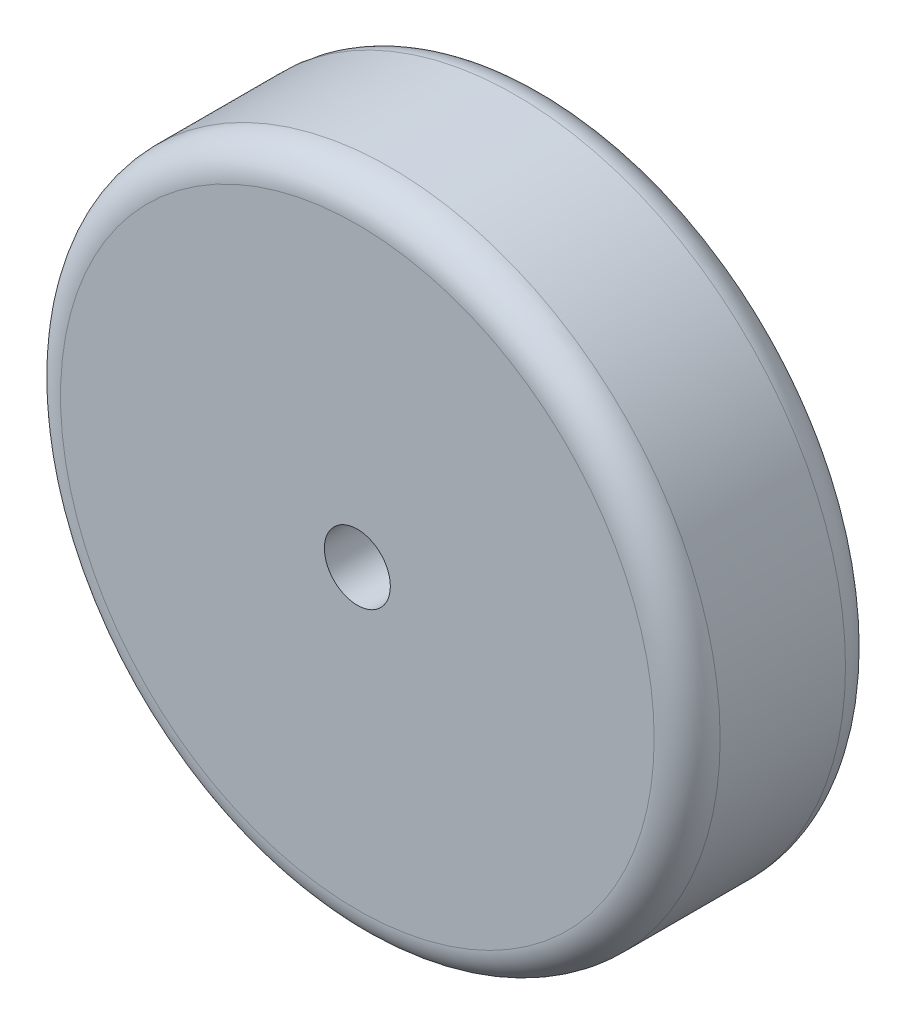
ISO-10303-21;
HEADER;
FILE_DESCRIPTION(('STEP AP214'),'2;1');
FILE_NAME('part.step','',(''),(''),'','','');
FILE_SCHEMA(('AUTOMOTIVE_DESIGN { 1 0 10303 214 1 1 1 1 }'));
ENDSEC;
DATA;
#1=APPLICATION_CONTEXT('core data for automotive mechanical design processes');
#2=APPLICATION_PROTOCOL_DEFINITION('international standard','automotive_design',2000,#1);
#3=PRODUCT_CONTEXT('',#1,'mechanical');
#4=PRODUCT('Part','Part','',(#3));
#5=PRODUCT_RELATED_PRODUCT_CATEGORY('part','',(#4));
#6=PRODUCT_DEFINITION_FORMATION('','',#4);
#7=PRODUCT_DEFINITION_CONTEXT('part definition',#1,'design');
#8=PRODUCT_DEFINITION('design','',#6,#7);
#9=PRODUCT_DEFINITION_SHAPE('','',#8);
#10=(LENGTH_UNIT() NAMED_UNIT(*) SI_UNIT(.MILLI.,.METRE.));
#11=(NAMED_UNIT(*) PLANE_ANGLE_UNIT() SI_UNIT($,.RADIAN.));
#12=(NAMED_UNIT(*) SI_UNIT($,.STERADIAN.) SOLID_ANGLE_UNIT());
#13=UNCERTAINTY_MEASURE_WITH_UNIT(LENGTH_MEASURE(1.E-05),#10,'distance_accuracy_value','');
#14=(GEOMETRIC_REPRESENTATION_CONTEXT(3) GLOBAL_UNCERTAINTY_ASSIGNED_CONTEXT((#13)) GLOBAL_UNIT_ASSIGNED_CONTEXT((#10,
#11,#12)) REPRESENTATION_CONTEXT('',''));
#15=CARTESIAN_POINT('',(0.,0.,0.));
#16=DIRECTION('',(0.,0.,1.));
#17=DIRECTION('',(1.,0.,0.));
#18=AXIS2_PLACEMENT_3D('',#15,#16,#17);
#19=CARTESIAN_POINT('',(0.,0.,29.));
#20=DIRECTION('',(0.,0.,-1.));
#21=DIRECTION('',(-1.,0.,0.));
#22=AXIS2_PLACEMENT_3D('',#19,#20,#21);
#23=CYLINDRICAL_SURFACE('',#22,50.);
#24=CARTESIAN_POINT('',(0.,0.,5.));
#25=DIRECTION('',(0.,0.,1.));
#26=DIRECTION('',(1.,0.,0.));
#27=AXIS2_PLACEMENT_3D('',#24,#25,#26);
#28=CIRCLE('',#27,50.);
#29=CARTESIAN_POINT('',(-50.,0.,5.));
#30=VERTEX_POINT('',#29);
#31=EDGE_CURVE('E54',#30,#30,#28,.T.);
#32=CARTESIAN_POINT('',(0.,0.,24.));
#33=DIRECTION('',(0.,0.,1.));
#34=DIRECTION('',(1.,0.,0.));
#35=AXIS2_PLACEMENT_3D('',#32,#33,#34);
#36=CIRCLE('',#35,50.);
#37=CARTESIAN_POINT('',(-50.,0.,24.));
#38=VERTEX_POINT('',#37);
#39=EDGE_CURVE('E59',#38,#38,#36,.F.);
#40=CARTESIAN_POINT('',(-50.,0.,5.));
#41=CARTESIAN_POINT('',(-50.,0.,5.19791666666666));
#42=CARTESIAN_POINT('',(-50.,0.,5.39583333333333));
#43=CARTESIAN_POINT('',(-50.,0.,5.79166666666666));
#44=CARTESIAN_POINT('',(-50.,0.,5.98958333333333));
#45=CARTESIAN_POINT('',(-50.,0.,6.38541666666667));
#46=CARTESIAN_POINT('',(-50.,0.,6.58333333333333));
#47=CARTESIAN_POINT('',(-50.,0.,6.97916666666667));
#48=CARTESIAN_POINT('',(-50.,0.,7.17708333333333));
#49=CARTESIAN_POINT('',(-50.,0.,7.57291666666667));
#50=CARTESIAN_POINT('',(-50.,0.,7.77083333333333));
#51=CARTESIAN_POINT('',(-50.,0.,8.16666666666666));
#52=CARTESIAN_POINT('',(-50.,0.,8.36458333333333));
#53=CARTESIAN_POINT('',(-50.,0.,8.76041666666666));
#54=CARTESIAN_POINT('',(-50.,0.,8.95833333333333));
#55=CARTESIAN_POINT('',(-50.,0.,9.35416666666666));
#56=CARTESIAN_POINT('',(-50.,0.,9.55208333333333));
#57=CARTESIAN_POINT('',(-50.,0.,9.94791666666667));
#58=CARTESIAN_POINT('',(-50.,0.,10.1458333333333));
#59=CARTESIAN_POINT('',(-50.,0.,10.5416666666667));
#60=CARTESIAN_POINT('',(-50.,0.,10.7395833333333));
#61=CARTESIAN_POINT('',(-50.,0.,11.1354166666667));
#62=CARTESIAN_POINT('',(-50.,0.,11.3333333333333));
#63=CARTESIAN_POINT('',(-50.,0.,11.7291666666667));
#64=CARTESIAN_POINT('',(-50.,0.,11.9270833333333));
#65=CARTESIAN_POINT('',(-50.,0.,12.3229166666667));
#66=CARTESIAN_POINT('',(-50.,0.,12.5208333333333));
#67=CARTESIAN_POINT('',(-50.,0.,12.9166666666667));
#68=CARTESIAN_POINT('',(-50.,0.,13.1145833333333));
#69=CARTESIAN_POINT('',(-50.,0.,13.5104166666667));
#70=CARTESIAN_POINT('',(-50.,0.,13.7083333333333));
#71=CARTESIAN_POINT('',(-50.,0.,14.1041666666667));
#72=CARTESIAN_POINT('',(-50.,0.,14.3020833333333));
#73=CARTESIAN_POINT('',(-50.,0.,14.6979166666667));
#74=CARTESIAN_POINT('',(-50.,0.,14.8958333333333));
#75=CARTESIAN_POINT('',(-50.,0.,15.2916666666667));
#76=CARTESIAN_POINT('',(-50.,0.,15.4895833333333));
#77=CARTESIAN_POINT('',(-50.,0.,15.8854166666667));
#78=CARTESIAN_POINT('',(-50.,0.,16.0833333333333));
#79=CARTESIAN_POINT('',(-50.,0.,16.4791666666667));
#80=CARTESIAN_POINT('',(-50.,0.,16.6770833333333));
#81=CARTESIAN_POINT('',(-50.,0.,17.0729166666667));
#82=CARTESIAN_POINT('',(-50.,0.,17.2708333333333));
#83=CARTESIAN_POINT('',(-50.,0.,17.6666666666667));
#84=CARTESIAN_POINT('',(-50.,0.,17.8645833333333));
#85=CARTESIAN_POINT('',(-50.,0.,18.2604166666667));
#86=CARTESIAN_POINT('',(-50.,0.,18.4583333333333));
#87=CARTESIAN_POINT('',(-50.,0.,18.8541666666667));
#88=CARTESIAN_POINT('',(-50.,0.,19.0520833333333));
#89=CARTESIAN_POINT('',(-50.,0.,19.4479166666667));
#90=CARTESIAN_POINT('',(-50.,0.,19.6458333333333));
#91=CARTESIAN_POINT('',(-50.,0.,20.0416666666667));
#92=CARTESIAN_POINT('',(-50.,0.,20.2395833333333));
#93=CARTESIAN_POINT('',(-50.,0.,20.6354166666667));
#94=CARTESIAN_POINT('',(-50.,0.,20.8333333333333));
#95=CARTESIAN_POINT('',(-50.,0.,21.2291666666667));
#96=CARTESIAN_POINT('',(-50.,0.,21.4270833333333));
#97=CARTESIAN_POINT('',(-50.,0.,21.8229166666667));
#98=CARTESIAN_POINT('',(-50.,0.,22.0208333333333));
#99=CARTESIAN_POINT('',(-50.,0.,22.4166666666667));
#100=CARTESIAN_POINT('',(-50.,0.,22.6145833333333));
#101=CARTESIAN_POINT('',(-50.,0.,23.0104166666667));
#102=CARTESIAN_POINT('',(-50.,0.,23.2083333333333));
#103=CARTESIAN_POINT('',(-50.,0.,23.6041666666667));
#104=CARTESIAN_POINT('',(-50.,0.,23.8020833333333));
#105=CARTESIAN_POINT('',(-50.,0.,24.));
#106=B_SPLINE_CURVE_WITH_KNOTS('',3,(#40,#41,#42,#43,#44,#45,#46,#47,#48,#49,#50,#51,#52,#53,
#54,#55,#56,#57,#58,#59,#60,#61,#62,#63,#64,#65,#66,#67,#68,#69,#70,#71,#72,#73,#74,#75,#76,#77,
#78,#79,#80,#81,#82,#83,#84,#85,#86,#87,#88,#89,#90,#91,#92,#93,#94,#95,#96,#97,#98,#99,#100,
#101,#102,#103,#104,#105),.UNSPECIFIED.,.F.,.F.,(4,2,2,2,2,2,2,2,2,2,2,2,2,2,2,2,2,2,2,2,2,2,2,
2,2,2,2,2,2,2,2,2,4),(0.,0.593750000000001,1.1875,1.78125,2.375,2.96875,3.5625,4.15625,4.75,
5.34375,5.9375,6.53125,7.125,7.71875,8.3125,8.90625,9.5,10.09375,10.6875,11.28125,11.875,
12.46875,13.0625,13.65625,14.25,14.84375,15.4375,16.03125,16.625,17.21875,17.8125,18.40625,19.),.UNSPECIFIED.);
#107=EDGE_CURVE('BSEAM41',#30,#38,#106,.T.);
#108=ORIENTED_EDGE('',*,*,#31,.T.);
#109=ORIENTED_EDGE('',*,*,#39,.T.);
#110=ORIENTED_EDGE('',*,*,#107,.T.);
#111=ORIENTED_EDGE('',*,*,#107,.F.);
#112=EDGE_LOOP('',(#108,#110,#109,#111));
#113=FACE_BOUND('',#112,.T.);
#114=ADVANCED_FACE('F41',(#113),#23,.T.);
#115=CARTESIAN_POINT('',(0.,0.,29.));
#116=DIRECTION('',(0.,0.,1.));
#117=DIRECTION('',(1.,0.,0.));
#118=AXIS2_PLACEMENT_3D('',#115,#116,#117);
#119=PLANE('',#118);
#120=CARTESIAN_POINT('',(0.,0.,29.));
#121=DIRECTION('',(0.,0.,1.));
#122=DIRECTION('',(1.,0.,0.));
#123=AXIS2_PLACEMENT_3D('',#120,#121,#122);
#124=CIRCLE('',#123,45.);
#125=CARTESIAN_POINT('',(45.,0.,29.));
#126=VERTEX_POINT('',#125);
#127=EDGE_CURVE('E10',#126,#126,#124,.T.);
#128=ORIENTED_EDGE('',*,*,#127,.T.);
#129=EDGE_LOOP('',(#128));
#130=FACE_BOUND('',#129,.T.);
#131=CARTESIAN_POINT('',(0.,0.,29.));
#132=DIRECTION('',(0.,0.,1.));
#133=DIRECTION('',(1.,0.,0.));
#134=AXIS2_PLACEMENT_3D('',#131,#132,#133);
#135=CIRCLE('',#134,5.);
#136=CARTESIAN_POINT('',(5.,0.,29.));
#137=VERTEX_POINT('',#136);
#138=EDGE_CURVE('E66',#137,#137,#135,.T.);
#139=ORIENTED_EDGE('',*,*,#138,.F.);
#140=EDGE_LOOP('',(#139));
#141=FACE_BOUND('',#140,.T.);
#142=ADVANCED_FACE('F83',(#130,#141),#119,.T.);
#143=CARTESIAN_POINT('',(0.,0.,0.));
#144=DIRECTION('',(0.,0.,1.));
#145=DIRECTION('',(1.,0.,0.));
#146=AXIS2_PLACEMENT_3D('',#143,#144,#145);
#147=PLANE('',#146);
#148=CARTESIAN_POINT('',(0.,0.,0.));
#149=DIRECTION('',(0.,0.,1.));
#150=DIRECTION('',(1.,0.,0.));
#151=AXIS2_PLACEMENT_3D('',#148,#149,#150);
#152=CIRCLE('',#151,45.);
#153=CARTESIAN_POINT('',(45.,0.,0.));
#154=VERTEX_POINT('',#153);
#155=EDGE_CURVE('E49',#154,#154,#152,.F.);
#156=ORIENTED_EDGE('',*,*,#155,.T.);
#157=EDGE_LOOP('',(#156));
#158=FACE_BOUND('',#157,.T.);
#159=CARTESIAN_POINT('',(0.,0.,0.));
#160=DIRECTION('',(0.,0.,1.));
#161=DIRECTION('',(1.,0.,0.));
#162=AXIS2_PLACEMENT_3D('',#159,#160,#161);
#163=CIRCLE('',#162,5.);
#164=CARTESIAN_POINT('',(5.,0.,0.));
#165=VERTEX_POINT('',#164);
#166=EDGE_CURVE('E65',#165,#165,#163,.T.);
#167=ORIENTED_EDGE('',*,*,#166,.T.);
#168=EDGE_LOOP('',(#167));
#169=FACE_BOUND('',#168,.T.);
#170=ADVANCED_FACE('F74',(#158,#169),#147,.F.);
#171=CARTESIAN_POINT('',(0.,0.,0.));
#172=DIRECTION('',(0.,0.,1.));
#173=DIRECTION('',(1.,0.,0.));
#174=AXIS2_PLACEMENT_3D('',#171,#172,#173);
#175=CYLINDRICAL_SURFACE('',#174,5.);
#176=CARTESIAN_POINT('',(5.,0.,0.));
#177=CARTESIAN_POINT('',(5.,0.,0.302083333333333));
#178=CARTESIAN_POINT('',(5.,0.,0.604166666666667));
#179=CARTESIAN_POINT('',(5.,0.,1.20833333333333));
#180=CARTESIAN_POINT('',(5.,0.,1.51041666666667));
#181=CARTESIAN_POINT('',(5.,0.,2.11458333333333));
#182=CARTESIAN_POINT('',(5.,0.,2.41666666666667));
#183=CARTESIAN_POINT('',(5.,0.,3.02083333333333));
#184=CARTESIAN_POINT('',(5.,0.,3.32291666666667));
#185=CARTESIAN_POINT('',(5.,0.,3.92708333333333));
#186=CARTESIAN_POINT('',(5.,0.,4.22916666666667));
#187=CARTESIAN_POINT('',(5.,0.,4.83333333333333));
#188=CARTESIAN_POINT('',(5.,0.,5.13541666666667));
#189=CARTESIAN_POINT('',(5.,0.,5.73958333333333));
#190=CARTESIAN_POINT('',(5.,0.,6.04166666666667));
#191=CARTESIAN_POINT('',(5.,0.,6.64583333333333));
#192=CARTESIAN_POINT('',(5.,0.,6.94791666666667));
#193=CARTESIAN_POINT('',(5.,0.,7.55208333333333));
#194=CARTESIAN_POINT('',(5.,0.,7.85416666666667));
#195=CARTESIAN_POINT('',(5.,0.,8.45833333333333));
#196=CARTESIAN_POINT('',(5.,0.,8.76041666666667));
#197=CARTESIAN_POINT('',(5.,0.,9.36458333333333));
#198=CARTESIAN_POINT('',(5.,0.,9.66666666666667));
#199=CARTESIAN_POINT('',(5.,0.,10.2708333333333));
#200=CARTESIAN_POINT('',(5.,0.,10.5729166666667));
#201=CARTESIAN_POINT('',(5.,0.,11.1770833333333));
#202=CARTESIAN_POINT('',(5.,0.,11.4791666666667));
#203=CARTESIAN_POINT('',(5.,0.,12.0833333333333));
#204=CARTESIAN_POINT('',(5.,0.,12.3854166666667));
#205=CARTESIAN_POINT('',(5.,0.,12.9895833333333));
#206=CARTESIAN_POINT('',(5.,0.,13.2916666666667));
#207=CARTESIAN_POINT('',(5.,0.,13.8958333333333));
#208=CARTESIAN_POINT('',(5.,0.,14.1979166666667));
#209=CARTESIAN_POINT('',(5.,0.,14.8020833333333));
#210=CARTESIAN_POINT('',(5.,0.,15.1041666666667));
#211=CARTESIAN_POINT('',(5.,0.,15.7083333333333));
#212=CARTESIAN_POINT('',(5.,0.,16.0104166666667));
#213=CARTESIAN_POINT('',(5.,0.,16.6145833333333));
#214=CARTESIAN_POINT('',(5.,0.,16.9166666666667));
#215=CARTESIAN_POINT('',(5.,0.,17.5208333333333));
#216=CARTESIAN_POINT('',(5.,0.,17.8229166666667));
#217=CARTESIAN_POINT('',(5.,0.,18.4270833333333));
#218=CARTESIAN_POINT('',(5.,0.,18.7291666666667));
#219=CARTESIAN_POINT('',(5.,0.,19.3333333333333));
#220=CARTESIAN_POINT('',(5.,0.,19.6354166666667));
#221=CARTESIAN_POINT('',(5.,0.,20.2395833333333));
#222=CARTESIAN_POINT('',(5.,0.,20.5416666666667));
#223=CARTESIAN_POINT('',(5.,0.,21.1458333333333));
#224=CARTESIAN_POINT('',(5.,0.,21.4479166666667));
#225=CARTESIAN_POINT('',(5.,0.,22.0520833333333));
#226=CARTESIAN_POINT('',(5.,0.,22.3541666666667));
#227=CARTESIAN_POINT('',(5.,0.,22.9583333333333));
#228=CARTESIAN_POINT('',(5.,0.,23.2604166666667));
#229=CARTESIAN_POINT('',(5.,0.,23.8645833333333));
#230=CARTESIAN_POINT('',(5.,0.,24.1666666666667));
#231=CARTESIAN_POINT('',(5.,0.,24.7708333333333));
#232=CARTESIAN_POINT('',(5.,0.,25.0729166666667));
#233=CARTESIAN_POINT('',(5.,0.,25.6770833333333));
#234=CARTESIAN_POINT('',(5.,0.,25.9791666666667));
#235=CARTESIAN_POINT('',(5.,0.,26.5833333333333));
#236=CARTESIAN_POINT('',(5.,0.,26.8854166666667));
#237=CARTESIAN_POINT('',(5.,0.,27.4895833333333));
#238=CARTESIAN_POINT('',(5.,0.,27.7916666666667));
#239=CARTESIAN_POINT('',(5.,0.,28.3958333333333));
#240=CARTESIAN_POINT('',(5.,0.,28.6979166666667));
#241=CARTESIAN_POINT('',(5.,0.,29.));
#242=B_SPLINE_CURVE_WITH_KNOTS('',3,(#176,#177,#178,#179,#180,#181,#182,#183,#184,#185,#186,
#187,#188,#189,#190,#191,#192,#193,#194,#195,#196,#197,#198,#199,#200,#201,#202,#203,#204,#205,
#206,#207,#208,#209,#210,#211,#212,#213,#214,#215,#216,#217,#218,#219,#220,#221,#222,#223,#224,
#225,#226,#227,#228,#229,#230,#231,#232,#233,#234,#235,#236,#237,#238,#239,#240,#241),
.UNSPECIFIED.,.F.,.F.,(4,2,2,2,2,2,2,2,2,2,2,2,2,2,2,2,2,2,2,2,2,2,2,2,2,2,2,2,2,2,2,2,4),(0.,
0.90625,1.8125,2.71875,3.625,4.53125,5.4375,6.34375,7.25,8.15625,9.0625,9.96875,10.875,11.78125,
12.6875,13.59375,14.5,15.40625,16.3125,17.21875,18.125,19.03125,19.9375,20.84375,21.75,22.65625,
23.5625,24.46875,25.375,26.28125,27.1875,28.09375,29.),.UNSPECIFIED.);
#243=EDGE_CURVE('BSEAM76',#165,#137,#242,.T.);
#244=ORIENTED_EDGE('',*,*,#166,.F.);
#245=ORIENTED_EDGE('',*,*,#138,.T.);
#246=ORIENTED_EDGE('',*,*,#243,.T.);
#247=ORIENTED_EDGE('',*,*,#243,.F.);
#248=EDGE_LOOP('',(#244,#246,#245,#247));
#249=FACE_BOUND('',#248,.T.);
#250=ADVANCED_FACE('F76',(#249),#175,.F.);
#251=CARTESIAN_POINT('',(0.,0.,5.));
#252=DIRECTION('',(0.,0.,1.));
#253=DIRECTION('',(1.,0.,0.));
#254=AXIS2_PLACEMENT_3D('',#251,#252,#253);
#255=TOROIDAL_SURFACE('',#254,45.,5.);
#256=ORIENTED_EDGE('',*,*,#155,.F.);
#257=EDGE_LOOP('',(#256));
#258=FACE_BOUND('',#257,.T.);
#259=ORIENTED_EDGE('',*,*,#31,.F.);
#260=EDGE_LOOP('',(#259));
#261=FACE_BOUND('',#260,.T.);
#262=ADVANCED_FACE('F79',(#258,#261),#255,.T.);
#263=CARTESIAN_POINT('',(0.,0.,24.));
#264=DIRECTION('',(0.,0.,1.));
#265=DIRECTION('',(1.,0.,0.));
#266=AXIS2_PLACEMENT_3D('',#263,#264,#265);
#267=TOROIDAL_SURFACE('',#266,45.,5.);
#268=ORIENTED_EDGE('',*,*,#39,.F.);
#269=EDGE_LOOP('',(#268));
#270=FACE_BOUND('',#269,.T.);
#271=ORIENTED_EDGE('',*,*,#127,.F.);
#272=EDGE_LOOP('',(#271));
#273=FACE_BOUND('',#272,.T.);
#274=ADVANCED_FACE('F43',(#270,#273),#267,.T.);
#275=CLOSED_SHELL('',(#114,#142,#170,#250,#262,#274));
#276=MANIFOLD_SOLID_BREP('B2',#275);
#277=ADVANCED_BREP_SHAPE_REPRESENTATION('',(#18,#276),#14);
#278=SHAPE_DEFINITION_REPRESENTATION(#9,#277);
ENDSEC;
END-ISO-10303-21;
